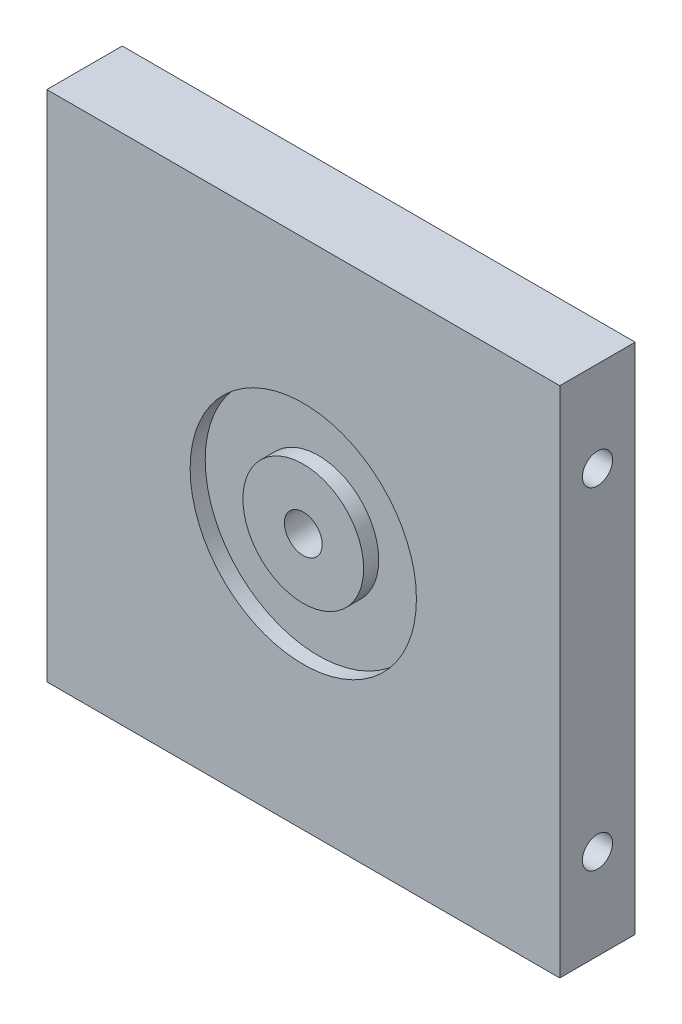
ISO-10303-21;
HEADER;
FILE_DESCRIPTION(('STEP AP214'),'2;1');
FILE_NAME('part.step','',(''),(''),'','','');
FILE_SCHEMA(('AUTOMOTIVE_DESIGN { 1 0 10303 214 1 1 1 1 }'));
ENDSEC;
DATA;
#1=APPLICATION_CONTEXT('core data for automotive mechanical design processes');
#2=APPLICATION_PROTOCOL_DEFINITION('international standard','automotive_design',2000,#1);
#3=PRODUCT_CONTEXT('',#1,'mechanical');
#4=PRODUCT('Part','Part','',(#3));
#5=PRODUCT_RELATED_PRODUCT_CATEGORY('part','',(#4));
#6=PRODUCT_DEFINITION_FORMATION('','',#4);
#7=PRODUCT_DEFINITION_CONTEXT('part definition',#1,'design');
#8=PRODUCT_DEFINITION('design','',#6,#7);
#9=PRODUCT_DEFINITION_SHAPE('','',#8);
#10=(LENGTH_UNIT() NAMED_UNIT(*) SI_UNIT(.MILLI.,.METRE.));
#11=(NAMED_UNIT(*) PLANE_ANGLE_UNIT() SI_UNIT($,.RADIAN.));
#12=(NAMED_UNIT(*) SI_UNIT($,.STERADIAN.) SOLID_ANGLE_UNIT());
#13=UNCERTAINTY_MEASURE_WITH_UNIT(LENGTH_MEASURE(1.E-05),#10,'distance_accuracy_value','');
#14=(GEOMETRIC_REPRESENTATION_CONTEXT(3) GLOBAL_UNCERTAINTY_ASSIGNED_CONTEXT((#13)) GLOBAL_UNIT_ASSIGNED_CONTEXT((#10,
#11,#12)) REPRESENTATION_CONTEXT('',''));
#15=CARTESIAN_POINT('',(0.,0.,0.));
#16=DIRECTION('',(0.,0.,1.));
#17=DIRECTION('',(1.,0.,0.));
#18=AXIS2_PLACEMENT_3D('',#15,#16,#17);
#19=CARTESIAN_POINT('',(-17.,-17.,2.5));
#20=DIRECTION('',(1.,0.,0.));
#21=DIRECTION('',(0.,0.,-1.));
#22=AXIS2_PLACEMENT_3D('',#19,#20,#21);
#23=PLANE('',#22);
#24=CARTESIAN_POINT('',(-17.,-11.,0.));
#25=DIRECTION('',(-1.,0.,0.));
#26=DIRECTION('',(0.,0.,1.));
#27=AXIS2_PLACEMENT_3D('',#24,#25,#26);
#28=CIRCLE('',#27,1.);
#29=CARTESIAN_POINT('',(-17.,-11.,1.));
#30=VERTEX_POINT('',#29);
#31=EDGE_CURVE('E147',#30,#30,#28,.T.);
#32=ORIENTED_EDGE('',*,*,#31,.F.);
#33=EDGE_LOOP('',(#32));
#34=FACE_BOUND('',#33,.T.);
#35=CARTESIAN_POINT('',(-17.,11.,0.));
#36=DIRECTION('',(-1.,0.,0.));
#37=DIRECTION('',(0.,0.,1.));
#38=AXIS2_PLACEMENT_3D('',#35,#36,#37);
#39=CIRCLE('',#38,1.);
#40=CARTESIAN_POINT('',(-17.,11.,1.));
#41=VERTEX_POINT('',#40);
#42=EDGE_CURVE('E141',#41,#41,#39,.T.);
#43=ORIENTED_EDGE('',*,*,#42,.F.);
#44=EDGE_LOOP('',(#43));
#45=FACE_BOUND('',#44,.T.);
#46=DIRECTION('',(0.,-1.,0.));
#47=VECTOR('',#46,1.);
#48=CARTESIAN_POINT('',(-17.,-17.,-2.5));
#49=LINE('',#48,#47);
#50=CARTESIAN_POINT('',(-17.,17.,-2.5));
#51=VERTEX_POINT('',#50);
#52=CARTESIAN_POINT('',(-17.,-17.,-2.5));
#53=VERTEX_POINT('',#52);
#54=EDGE_CURVE('E109',#51,#53,#49,.T.);
#55=ORIENTED_EDGE('',*,*,#54,.T.);
#56=DIRECTION('',(0.,0.,-1.));
#57=VECTOR('',#56,1.);
#58=CARTESIAN_POINT('',(-17.,-17.,2.5));
#59=LINE('',#58,#57);
#60=CARTESIAN_POINT('',(-17.,-17.,2.5));
#61=VERTEX_POINT('',#60);
#62=EDGE_CURVE('E13',#61,#53,#59,.T.);
#63=ORIENTED_EDGE('',*,*,#62,.F.);
#64=DIRECTION('',(0.,-1.,0.));
#65=VECTOR('',#64,1.);
#66=CARTESIAN_POINT('',(-17.,-17.,2.5));
#67=LINE('',#66,#65);
#68=CARTESIAN_POINT('',(-17.,17.,2.5));
#69=VERTEX_POINT('',#68);
#70=EDGE_CURVE('E97',#69,#61,#67,.T.);
#71=ORIENTED_EDGE('',*,*,#70,.F.);
#72=DIRECTION('',(0.,0.,-1.));
#73=VECTOR('',#72,1.);
#74=CARTESIAN_POINT('',(-17.,17.,2.5));
#75=LINE('',#74,#73);
#76=EDGE_CURVE('E105',#69,#51,#75,.T.);
#77=ORIENTED_EDGE('',*,*,#76,.T.);
#78=EDGE_LOOP('',(#55,#63,#71,#77));
#79=FACE_BOUND('',#78,.T.);
#80=ADVANCED_FACE('F46',(#34,#45,#79),#23,.F.);
#81=CARTESIAN_POINT('',(17.,-17.,2.5));
#82=DIRECTION('',(0.,1.,0.));
#83=DIRECTION('',(-1.,0.,0.));
#84=AXIS2_PLACEMENT_3D('',#81,#82,#83);
#85=PLANE('',#84);
#86=DIRECTION('',(1.,0.,0.));
#87=VECTOR('',#86,1.);
#88=CARTESIAN_POINT('',(17.,-17.,-2.5));
#89=LINE('',#88,#87);
#90=CARTESIAN_POINT('',(17.,-17.,-2.5));
#91=VERTEX_POINT('',#90);
#92=EDGE_CURVE('E101',#53,#91,#89,.T.);
#93=ORIENTED_EDGE('',*,*,#92,.T.);
#94=DIRECTION('',(0.,0.,-1.));
#95=VECTOR('',#94,1.);
#96=CARTESIAN_POINT('',(17.,-17.,2.5));
#97=LINE('',#96,#95);
#98=CARTESIAN_POINT('',(17.,-17.,2.5));
#99=VERTEX_POINT('',#98);
#100=EDGE_CURVE('E54',#99,#91,#97,.T.);
#101=ORIENTED_EDGE('',*,*,#100,.F.);
#102=DIRECTION('',(1.,0.,0.));
#103=VECTOR('',#102,1.);
#104=CARTESIAN_POINT('',(17.,-17.,2.5));
#105=LINE('',#104,#103);
#106=EDGE_CURVE('E92',#61,#99,#105,.T.);
#107=ORIENTED_EDGE('',*,*,#106,.F.);
#108=ORIENTED_EDGE('',*,*,#62,.T.);
#109=EDGE_LOOP('',(#93,#101,#107,#108));
#110=FACE_BOUND('',#109,.T.);
#111=ADVANCED_FACE('F100',(#110),#85,.F.);
#112=CARTESIAN_POINT('',(17.,-17.,2.5));
#113=DIRECTION('',(-1.,0.,0.));
#114=DIRECTION('',(0.,0.,1.));
#115=AXIS2_PLACEMENT_3D('',#112,#113,#114);
#116=PLANE('',#115);
#117=CARTESIAN_POINT('',(17.,-11.,0.));
#118=DIRECTION('',(-1.,0.,0.));
#119=DIRECTION('',(0.,0.,1.));
#120=AXIS2_PLACEMENT_3D('',#117,#118,#119);
#121=CIRCLE('',#120,1.);
#122=CARTESIAN_POINT('',(17.,-11.,1.));
#123=VERTEX_POINT('',#122);
#124=EDGE_CURVE('E159',#123,#123,#121,.T.);
#125=ORIENTED_EDGE('',*,*,#124,.T.);
#126=EDGE_LOOP('',(#125));
#127=FACE_BOUND('',#126,.T.);
#128=CARTESIAN_POINT('',(17.,11.,0.));
#129=DIRECTION('',(-1.,0.,0.));
#130=DIRECTION('',(0.,0.,1.));
#131=AXIS2_PLACEMENT_3D('',#128,#129,#130);
#132=CIRCLE('',#131,1.);
#133=CARTESIAN_POINT('',(17.,11.,1.));
#134=VERTEX_POINT('',#133);
#135=EDGE_CURVE('E153',#134,#134,#132,.T.);
#136=ORIENTED_EDGE('',*,*,#135,.T.);
#137=EDGE_LOOP('',(#136));
#138=FACE_BOUND('',#137,.T.);
#139=DIRECTION('',(0.,1.,0.));
#140=VECTOR('',#139,1.);
#141=CARTESIAN_POINT('',(17.,-17.,-2.5));
#142=LINE('',#141,#140);
#143=CARTESIAN_POINT('',(17.,17.,-2.5));
#144=VERTEX_POINT('',#143);
#145=EDGE_CURVE('E79',#91,#144,#142,.T.);
#146=ORIENTED_EDGE('',*,*,#145,.T.);
#147=DIRECTION('',(0.,0.,-1.));
#148=VECTOR('',#147,1.);
#149=CARTESIAN_POINT('',(17.,17.,2.5));
#150=LINE('',#149,#148);
#151=CARTESIAN_POINT('',(17.,17.,2.5));
#152=VERTEX_POINT('',#151);
#153=EDGE_CURVE('E102',#152,#144,#150,.T.);
#154=ORIENTED_EDGE('',*,*,#153,.F.);
#155=DIRECTION('',(0.,1.,0.));
#156=VECTOR('',#155,1.);
#157=CARTESIAN_POINT('',(17.,-17.,2.5));
#158=LINE('',#157,#156);
#159=EDGE_CURVE('E95',#99,#152,#158,.T.);
#160=ORIENTED_EDGE('',*,*,#159,.F.);
#161=ORIENTED_EDGE('',*,*,#100,.T.);
#162=EDGE_LOOP('',(#146,#154,#160,#161));
#163=FACE_BOUND('',#162,.T.);
#164=ADVANCED_FACE('F103',(#127,#138,#163),#116,.F.);
#165=CARTESIAN_POINT('',(17.,17.,2.5));
#166=DIRECTION('',(0.,-1.,0.));
#167=DIRECTION('',(1.,0.,0.));
#168=AXIS2_PLACEMENT_3D('',#165,#166,#167);
#169=PLANE('',#168);
#170=DIRECTION('',(-1.,0.,0.));
#171=VECTOR('',#170,1.);
#172=CARTESIAN_POINT('',(17.,17.,-2.5));
#173=LINE('',#172,#171);
#174=EDGE_CURVE('E85',#144,#51,#173,.T.);
#175=ORIENTED_EDGE('',*,*,#174,.T.);
#176=ORIENTED_EDGE('',*,*,#76,.F.);
#177=DIRECTION('',(-1.,0.,0.));
#178=VECTOR('',#177,1.);
#179=CARTESIAN_POINT('',(17.,17.,2.5));
#180=LINE('',#179,#178);
#181=EDGE_CURVE('E62',#152,#69,#180,.T.);
#182=ORIENTED_EDGE('',*,*,#181,.F.);
#183=ORIENTED_EDGE('',*,*,#153,.T.);
#184=EDGE_LOOP('',(#175,#176,#182,#183));
#185=FACE_BOUND('',#184,.T.);
#186=ADVANCED_FACE('F117',(#185),#169,.F.);
#187=CARTESIAN_POINT('',(0.,0.,2.5));
#188=DIRECTION('',(0.,0.,1.));
#189=DIRECTION('',(1.,0.,0.));
#190=AXIS2_PLACEMENT_3D('',#187,#188,#189);
#191=PLANE('',#190);
#192=CARTESIAN_POINT('',(0.,0.,2.5));
#193=DIRECTION('',(0.,0.,1.));
#194=DIRECTION('',(1.,0.,0.));
#195=AXIS2_PLACEMENT_3D('',#192,#193,#194);
#196=CIRCLE('',#195,7.5);
#197=CARTESIAN_POINT('',(7.5,0.,2.5));
#198=VERTEX_POINT('',#197);
#199=EDGE_CURVE('E123',#198,#198,#196,.T.);
#200=ORIENTED_EDGE('',*,*,#199,.F.);
#201=EDGE_LOOP('',(#200));
#202=FACE_BOUND('',#201,.T.);
#203=ORIENTED_EDGE('',*,*,#70,.T.);
#204=ORIENTED_EDGE('',*,*,#106,.T.);
#205=ORIENTED_EDGE('',*,*,#159,.T.);
#206=ORIENTED_EDGE('',*,*,#181,.T.);
#207=EDGE_LOOP('',(#203,#204,#205,#206));
#208=FACE_BOUND('',#207,.T.);
#209=ADVANCED_FACE('F93',(#202,#208),#191,.T.);
#210=CARTESIAN_POINT('',(0.,0.,-2.5));
#211=DIRECTION('',(0.,0.,1.));
#212=DIRECTION('',(1.,0.,0.));
#213=AXIS2_PLACEMENT_3D('',#210,#211,#212);
#214=PLANE('',#213);
#215=CARTESIAN_POINT('',(0.,0.,-2.5));
#216=DIRECTION('',(0.,0.,1.));
#217=DIRECTION('',(1.,0.,0.));
#218=AXIS2_PLACEMENT_3D('',#215,#216,#217);
#219=CIRCLE('',#218,1.25);
#220=CARTESIAN_POINT('',(1.25,0.,-2.5));
#221=VERTEX_POINT('',#220);
#222=EDGE_CURVE('E132',#221,#221,#219,.F.);
#223=ORIENTED_EDGE('',*,*,#222,.F.);
#224=EDGE_LOOP('',(#223));
#225=FACE_BOUND('',#224,.T.);
#226=ORIENTED_EDGE('',*,*,#54,.F.);
#227=ORIENTED_EDGE('',*,*,#174,.F.);
#228=ORIENTED_EDGE('',*,*,#145,.F.);
#229=ORIENTED_EDGE('',*,*,#92,.F.);
#230=EDGE_LOOP('',(#226,#227,#228,#229));
#231=FACE_BOUND('',#230,.T.);
#232=ADVANCED_FACE('F120',(#225,#231),#214,.F.);
#233=CARTESIAN_POINT('',(0.,0.,1.5));
#234=DIRECTION('',(0.,0.,1.));
#235=DIRECTION('',(1.,0.,0.));
#236=AXIS2_PLACEMENT_3D('',#233,#234,#235);
#237=CYLINDRICAL_SURFACE('',#236,7.5);
#238=CARTESIAN_POINT('',(0.,0.,1.5));
#239=DIRECTION('',(0.,0.,1.));
#240=DIRECTION('',(1.,0.,0.));
#241=AXIS2_PLACEMENT_3D('',#238,#239,#240);
#242=CIRCLE('',#241,7.5);
#243=CARTESIAN_POINT('',(7.5,0.,1.5));
#244=VERTEX_POINT('',#243);
#245=EDGE_CURVE('E112',#244,#244,#242,.T.);
#246=ORIENTED_EDGE('',*,*,#245,.F.);
#247=EDGE_LOOP('',(#246));
#248=FACE_BOUND('',#247,.T.);
#249=ORIENTED_EDGE('',*,*,#199,.T.);
#250=EDGE_LOOP('',(#249));
#251=FACE_BOUND('',#250,.T.);
#252=ADVANCED_FACE('F211',(#248,#251),#237,.F.);
#253=CARTESIAN_POINT('',(0.,0.,1.5));
#254=DIRECTION('',(0.,0.,1.));
#255=DIRECTION('',(1.,0.,0.));
#256=AXIS2_PLACEMENT_3D('',#253,#254,#255);
#257=PLANE('',#256);
#258=CARTESIAN_POINT('',(0.,0.,1.5));
#259=DIRECTION('',(0.,0.,1.));
#260=DIRECTION('',(1.,0.,0.));
#261=AXIS2_PLACEMENT_3D('',#258,#259,#260);
#262=CIRCLE('',#261,4.);
#263=CARTESIAN_POINT('',(4.,0.,1.5));
#264=VERTEX_POINT('',#263);
#265=EDGE_CURVE('E126',#264,#264,#262,.T.);
#266=ORIENTED_EDGE('',*,*,#265,.F.);
#267=EDGE_LOOP('',(#266));
#268=FACE_BOUND('',#267,.T.);
#269=ORIENTED_EDGE('',*,*,#245,.T.);
#270=EDGE_LOOP('',(#269));
#271=FACE_BOUND('',#270,.T.);
#272=ADVANCED_FACE('F207',(#268,#271),#257,.T.);
#273=CARTESIAN_POINT('',(0.,0.,1.5));
#274=DIRECTION('',(0.,0.,1.));
#275=DIRECTION('',(1.,0.,0.));
#276=AXIS2_PLACEMENT_3D('',#273,#274,#275);
#277=CYLINDRICAL_SURFACE('',#276,4.);
#278=ORIENTED_EDGE('',*,*,#265,.T.);
#279=EDGE_LOOP('',(#278));
#280=FACE_BOUND('',#279,.T.);
#281=CARTESIAN_POINT('',(0.,0.,2.5));
#282=DIRECTION('',(0.,0.,1.));
#283=DIRECTION('',(1.,0.,0.));
#284=AXIS2_PLACEMENT_3D('',#281,#282,#283);
#285=CIRCLE('',#284,4.);
#286=CARTESIAN_POINT('',(4.,0.,2.5));
#287=VERTEX_POINT('',#286);
#288=EDGE_CURVE('E129',#287,#287,#285,.T.);
#289=ORIENTED_EDGE('',*,*,#288,.F.);
#290=EDGE_LOOP('',(#289));
#291=FACE_BOUND('',#290,.T.);
#292=ADVANCED_FACE('F204',(#280,#291),#277,.T.);
#293=CARTESIAN_POINT('',(0.,0.,2.5));
#294=DIRECTION('',(0.,0.,1.));
#295=DIRECTION('',(1.,0.,0.));
#296=AXIS2_PLACEMENT_3D('',#293,#294,#295);
#297=CIRCLE('',#296,1.25);
#298=CARTESIAN_POINT('',(1.25,0.,2.5));
#299=VERTEX_POINT('',#298);
#300=EDGE_CURVE('E137',#299,#299,#297,.T.);
#301=ORIENTED_EDGE('',*,*,#300,.F.);
#302=EDGE_LOOP('',(#301));
#303=FACE_BOUND('',#302,.T.);
#304=ORIENTED_EDGE('',*,*,#288,.T.);
#305=EDGE_LOOP('',(#304));
#306=FACE_BOUND('',#305,.T.);
#307=ADVANCED_FACE('F198',(#303,#306),#191,.T.);
#308=CARTESIAN_POINT('',(0.,0.,-6.03553390593274));
#309=DIRECTION('',(0.,0.,1.));
#310=DIRECTION('',(1.,0.,0.));
#311=AXIS2_PLACEMENT_3D('',#308,#309,#310);
#312=CYLINDRICAL_SURFACE('',#311,1.25);
#313=CARTESIAN_POINT('',(1.25,0.,-2.5));
#314=CARTESIAN_POINT('',(1.25,0.,-2.44791666666667));
#315=CARTESIAN_POINT('',(1.25,0.,-2.39583333333333));
#316=CARTESIAN_POINT('',(1.25,0.,-2.29166666666667));
#317=CARTESIAN_POINT('',(1.25,0.,-2.23958333333333));
#318=CARTESIAN_POINT('',(1.25,0.,-2.13541666666667));
#319=CARTESIAN_POINT('',(1.25,0.,-2.08333333333333));
#320=CARTESIAN_POINT('',(1.25,0.,-1.97916666666667));
#321=CARTESIAN_POINT('',(1.25,0.,-1.92708333333333));
#322=CARTESIAN_POINT('',(1.25,0.,-1.82291666666667));
#323=CARTESIAN_POINT('',(1.25,0.,-1.77083333333333));
#324=CARTESIAN_POINT('',(1.25,0.,-1.66666666666667));
#325=CARTESIAN_POINT('',(1.25,0.,-1.61458333333333));
#326=CARTESIAN_POINT('',(1.25,0.,-1.51041666666667));
#327=CARTESIAN_POINT('',(1.25,0.,-1.45833333333333));
#328=CARTESIAN_POINT('',(1.25,0.,-1.35416666666667));
#329=CARTESIAN_POINT('',(1.25,0.,-1.30208333333333));
#330=CARTESIAN_POINT('',(1.25,0.,-1.19791666666667));
#331=CARTESIAN_POINT('',(1.25,0.,-1.14583333333333));
#332=CARTESIAN_POINT('',(1.25,0.,-1.04166666666667));
#333=CARTESIAN_POINT('',(1.25,0.,-0.989583333333333));
#334=CARTESIAN_POINT('',(1.25,0.,-0.885416666666667));
#335=CARTESIAN_POINT('',(1.25,0.,-0.833333333333334));
#336=CARTESIAN_POINT('',(1.25,0.,-0.729166666666667));
#337=CARTESIAN_POINT('',(1.25,0.,-0.677083333333334));
#338=CARTESIAN_POINT('',(1.25,0.,-0.572916666666667));
#339=CARTESIAN_POINT('',(1.25,0.,-0.520833333333334));
#340=CARTESIAN_POINT('',(1.25,0.,-0.416666666666667));
#341=CARTESIAN_POINT('',(1.25,0.,-0.364583333333334));
#342=CARTESIAN_POINT('',(1.25,0.,-0.260416666666667));
#343=CARTESIAN_POINT('',(1.25,0.,-0.208333333333334));
#344=CARTESIAN_POINT('',(1.25,0.,-0.104166666666668));
#345=CARTESIAN_POINT('',(1.25,0.,-0.0520833333333342));
#346=CARTESIAN_POINT('',(1.25,0.,0.0520833333333325));
#347=CARTESIAN_POINT('',(1.25,0.,0.104166666666666));
#348=CARTESIAN_POINT('',(1.25,0.,0.208333333333333));
#349=CARTESIAN_POINT('',(1.25,0.,0.260416666666666));
#350=CARTESIAN_POINT('',(1.25,0.,0.364583333333333));
#351=CARTESIAN_POINT('',(1.25,0.,0.416666666666666));
#352=CARTESIAN_POINT('',(1.25,0.,0.520833333333333));
#353=CARTESIAN_POINT('',(1.25,0.,0.572916666666666));
#354=CARTESIAN_POINT('',(1.25,0.,0.677083333333333));
#355=CARTESIAN_POINT('',(1.25,0.,0.729166666666667));
#356=CARTESIAN_POINT('',(1.25,0.,0.833333333333333));
#357=CARTESIAN_POINT('',(1.25,0.,0.885416666666667));
#358=CARTESIAN_POINT('',(1.25,0.,0.989583333333333));
#359=CARTESIAN_POINT('',(1.25,0.,1.04166666666667));
#360=CARTESIAN_POINT('',(1.25,0.,1.14583333333333));
#361=CARTESIAN_POINT('',(1.25,0.,1.19791666666667));
#362=CARTESIAN_POINT('',(1.25,0.,1.30208333333333));
#363=CARTESIAN_POINT('',(1.25,0.,1.35416666666667));
#364=CARTESIAN_POINT('',(1.25,0.,1.45833333333333));
#365=CARTESIAN_POINT('',(1.25,0.,1.51041666666667));
#366=CARTESIAN_POINT('',(1.25,0.,1.61458333333333));
#367=CARTESIAN_POINT('',(1.25,0.,1.66666666666667));
#368=CARTESIAN_POINT('',(1.25,0.,1.77083333333333));
#369=CARTESIAN_POINT('',(1.25,0.,1.82291666666667));
#370=CARTESIAN_POINT('',(1.25,0.,1.92708333333333));
#371=CARTESIAN_POINT('',(1.25,0.,1.97916666666667));
#372=CARTESIAN_POINT('',(1.25,0.,2.08333333333333));
#373=CARTESIAN_POINT('',(1.25,0.,2.13541666666667));
#374=CARTESIAN_POINT('',(1.25,0.,2.23958333333333));
#375=CARTESIAN_POINT('',(1.25,0.,2.29166666666667));
#376=CARTESIAN_POINT('',(1.25,0.,2.39583333333333));
#377=CARTESIAN_POINT('',(1.25,0.,2.44791666666667));
#378=CARTESIAN_POINT('',(1.25,0.,2.5));
#379=B_SPLINE_CURVE_WITH_KNOTS('',3,(#313,#314,#315,#316,#317,#318,#319,#320,#321,#322,#323,
#324,#325,#326,#327,#328,#329,#330,#331,#332,#333,#334,#335,#336,#337,#338,#339,#340,#341,#342,
#343,#344,#345,#346,#347,#348,#349,#350,#351,#352,#353,#354,#355,#356,#357,#358,#359,#360,#361,
#362,#363,#364,#365,#366,#367,#368,#369,#370,#371,#372,#373,#374,#375,#376,#377,#378),
.UNSPECIFIED.,.F.,.F.,(4,2,2,2,2,2,2,2,2,2,2,2,2,2,2,2,2,2,2,2,2,2,2,2,2,2,2,2,2,2,2,2,4),(0.,
0.15625,0.3125,0.468749999999999,0.624999999999999,0.781249999999999,0.9375,1.09375,1.25,
1.40625,1.5625,1.71875,1.875,2.03125,2.1875,2.34375,2.5,2.65625,2.8125,2.96875,3.125,3.28125,
3.4375,3.59375,3.75,3.90625,4.0625,4.21875,4.375,4.53125,4.6875,4.84375,5.),.UNSPECIFIED.);
#380=EDGE_CURVE('BSEAM188',#221,#299,#379,.T.);
#381=ORIENTED_EDGE('',*,*,#222,.T.);
#382=ORIENTED_EDGE('',*,*,#300,.T.);
#383=ORIENTED_EDGE('',*,*,#380,.T.);
#384=ORIENTED_EDGE('',*,*,#380,.F.);
#385=EDGE_LOOP('',(#381,#383,#382,#384));
#386=FACE_BOUND('',#385,.T.);
#387=ADVANCED_FACE('F188',(#386),#312,.F.);
#388=CARTESIAN_POINT('',(-7.,11.,0.));
#389=DIRECTION('',(-1.,0.,0.));
#390=DIRECTION('',(0.,0.,1.));
#391=AXIS2_PLACEMENT_3D('',#388,#389,#390);
#392=CYLINDRICAL_SURFACE('',#391,1.);
#393=CARTESIAN_POINT('',(-7.,11.,0.));
#394=DIRECTION('',(-1.,0.,0.));
#395=DIRECTION('',(0.,0.,1.));
#396=AXIS2_PLACEMENT_3D('',#393,#394,#395);
#397=CIRCLE('',#396,1.);
#398=CARTESIAN_POINT('',(-7.,11.,1.));
#399=VERTEX_POINT('',#398);
#400=EDGE_CURVE('E140',#399,#399,#397,.T.);
#401=ORIENTED_EDGE('',*,*,#400,.F.);
#402=EDGE_LOOP('',(#401));
#403=FACE_BOUND('',#402,.T.);
#404=ORIENTED_EDGE('',*,*,#42,.T.);
#405=EDGE_LOOP('',(#404));
#406=FACE_BOUND('',#405,.T.);
#407=ADVANCED_FACE('F185',(#403,#406),#392,.F.);
#408=CARTESIAN_POINT('',(-7.,11.,0.));
#409=DIRECTION('',(-1.,0.,0.));
#410=DIRECTION('',(0.,0.,1.));
#411=AXIS2_PLACEMENT_3D('',#408,#409,#410);
#412=PLANE('',#411);
#413=ORIENTED_EDGE('',*,*,#400,.T.);
#414=EDGE_LOOP('',(#413));
#415=FACE_BOUND('',#414,.T.);
#416=ADVANCED_FACE('F187',(#415),#412,.T.);
#417=CARTESIAN_POINT('',(-7.,-11.,0.));
#418=DIRECTION('',(-1.,0.,0.));
#419=DIRECTION('',(0.,0.,1.));
#420=AXIS2_PLACEMENT_3D('',#417,#418,#419);
#421=CYLINDRICAL_SURFACE('',#420,1.);
#422=CARTESIAN_POINT('',(-7.,-11.,0.));
#423=DIRECTION('',(-1.,0.,0.));
#424=DIRECTION('',(0.,0.,1.));
#425=AXIS2_PLACEMENT_3D('',#422,#423,#424);
#426=CIRCLE('',#425,1.);
#427=CARTESIAN_POINT('',(-7.,-11.,1.));
#428=VERTEX_POINT('',#427);
#429=EDGE_CURVE('E144',#428,#428,#426,.T.);
#430=ORIENTED_EDGE('',*,*,#429,.F.);
#431=EDGE_LOOP('',(#430));
#432=FACE_BOUND('',#431,.T.);
#433=ORIENTED_EDGE('',*,*,#31,.T.);
#434=EDGE_LOOP('',(#433));
#435=FACE_BOUND('',#434,.T.);
#436=ADVANCED_FACE('F195',(#432,#435),#421,.F.);
#437=CARTESIAN_POINT('',(-7.,-11.,0.));
#438=DIRECTION('',(-1.,0.,0.));
#439=DIRECTION('',(0.,0.,1.));
#440=AXIS2_PLACEMENT_3D('',#437,#438,#439);
#441=PLANE('',#440);
#442=ORIENTED_EDGE('',*,*,#429,.T.);
#443=EDGE_LOOP('',(#442));
#444=FACE_BOUND('',#443,.T.);
#445=ADVANCED_FACE('F234',(#444),#441,.T.);
#446=CARTESIAN_POINT('',(7.,11.,0.));
#447=DIRECTION('',(1.,0.,0.));
#448=DIRECTION('',(0.,0.,-1.));
#449=AXIS2_PLACEMENT_3D('',#446,#447,#448);
#450=CYLINDRICAL_SURFACE('',#449,1.);
#451=CARTESIAN_POINT('',(7.,11.,0.));
#452=DIRECTION('',(-1.,0.,0.));
#453=DIRECTION('',(0.,0.,1.));
#454=AXIS2_PLACEMENT_3D('',#451,#452,#453);
#455=CIRCLE('',#454,1.);
#456=CARTESIAN_POINT('',(7.,11.,1.));
#457=VERTEX_POINT('',#456);
#458=EDGE_CURVE('E150',#457,#457,#455,.T.);
#459=ORIENTED_EDGE('',*,*,#458,.T.);
#460=EDGE_LOOP('',(#459));
#461=FACE_BOUND('',#460,.T.);
#462=ORIENTED_EDGE('',*,*,#135,.F.);
#463=EDGE_LOOP('',(#462));
#464=FACE_BOUND('',#463,.T.);
#465=ADVANCED_FACE('F232',(#461,#464),#450,.F.);
#466=CARTESIAN_POINT('',(7.,11.,0.));
#467=DIRECTION('',(1.,0.,0.));
#468=DIRECTION('',(0.,0.,1.));
#469=AXIS2_PLACEMENT_3D('',#466,#467,#468);
#470=PLANE('',#469);
#471=ORIENTED_EDGE('',*,*,#458,.F.);
#472=EDGE_LOOP('',(#471));
#473=FACE_BOUND('',#472,.T.);
#474=ADVANCED_FACE('F174',(#473),#470,.T.);
#475=CARTESIAN_POINT('',(7.,-11.,0.));
#476=DIRECTION('',(1.,0.,0.));
#477=DIRECTION('',(0.,0.,-1.));
#478=AXIS2_PLACEMENT_3D('',#475,#476,#477);
#479=CYLINDRICAL_SURFACE('',#478,1.);
#480=CARTESIAN_POINT('',(7.,-11.,0.));
#481=DIRECTION('',(-1.,0.,0.));
#482=DIRECTION('',(0.,0.,1.));
#483=AXIS2_PLACEMENT_3D('',#480,#481,#482);
#484=CIRCLE('',#483,1.);
#485=CARTESIAN_POINT('',(7.,-11.,1.));
#486=VERTEX_POINT('',#485);
#487=EDGE_CURVE('E156',#486,#486,#484,.T.);
#488=ORIENTED_EDGE('',*,*,#487,.T.);
#489=EDGE_LOOP('',(#488));
#490=FACE_BOUND('',#489,.T.);
#491=ORIENTED_EDGE('',*,*,#124,.F.);
#492=EDGE_LOOP('',(#491));
#493=FACE_BOUND('',#492,.T.);
#494=ADVANCED_FACE('F165',(#490,#493),#479,.F.);
#495=CARTESIAN_POINT('',(7.,-11.,0.));
#496=DIRECTION('',(1.,0.,0.));
#497=DIRECTION('',(0.,0.,1.));
#498=AXIS2_PLACEMENT_3D('',#495,#496,#497);
#499=PLANE('',#498);
#500=ORIENTED_EDGE('',*,*,#487,.F.);
#501=EDGE_LOOP('',(#500));
#502=FACE_BOUND('',#501,.T.);
#503=ADVANCED_FACE('F168',(#502),#499,.T.);
#504=CLOSED_SHELL('',(#80,#111,#164,#186,#209,#232,#252,#272,#292,#307,#387,#407,#416,#436,#445,
#465,#474,#494,#503));
#505=MANIFOLD_SOLID_BREP('B2',#504);
#506=ADVANCED_BREP_SHAPE_REPRESENTATION('',(#18,#505),#14);
#507=SHAPE_DEFINITION_REPRESENTATION(#9,#506);
ENDSEC;
END-ISO-10303-21;
